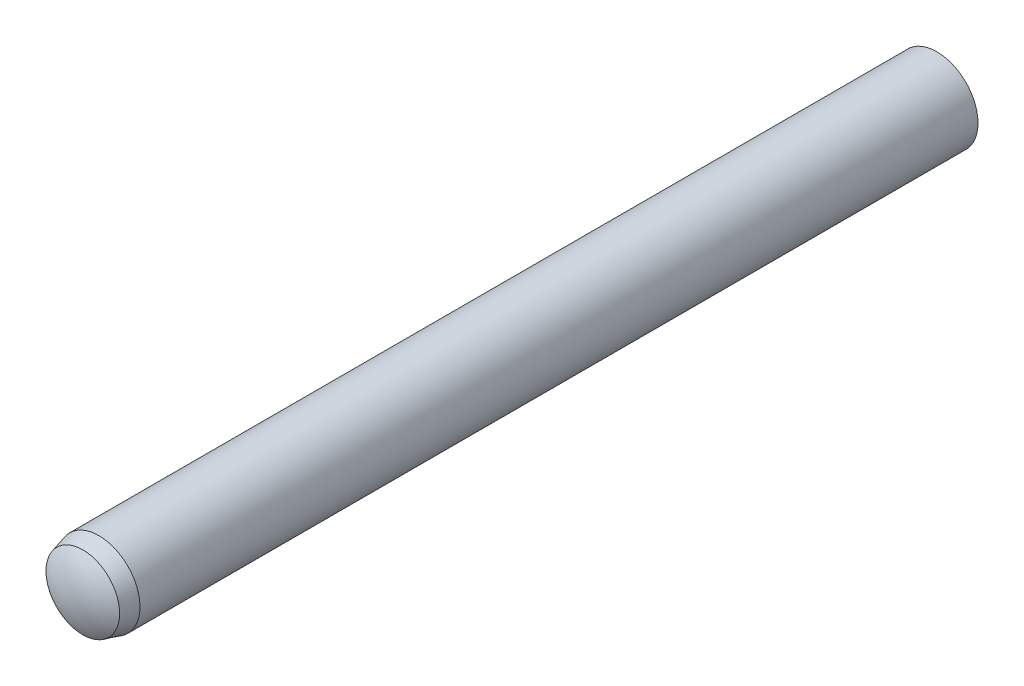
ISO-10303-21;
HEADER;
FILE_DESCRIPTION(('STEP AP214'),'2;1');
FILE_NAME('part.step','',(''),(''),'','','');
FILE_SCHEMA(('AUTOMOTIVE_DESIGN { 1 0 10303 214 1 1 1 1 }'));
ENDSEC;
DATA;
#1=APPLICATION_CONTEXT('core data for automotive mechanical design processes');
#2=APPLICATION_PROTOCOL_DEFINITION('international standard','automotive_design',2000,#1);
#3=PRODUCT_CONTEXT('',#1,'mechanical');
#4=PRODUCT('Part','Part','',(#3));
#5=PRODUCT_RELATED_PRODUCT_CATEGORY('part','',(#4));
#6=PRODUCT_DEFINITION_FORMATION('','',#4);
#7=PRODUCT_DEFINITION_CONTEXT('part definition',#1,'design');
#8=PRODUCT_DEFINITION('design','',#6,#7);
#9=PRODUCT_DEFINITION_SHAPE('','',#8);
#10=(LENGTH_UNIT() NAMED_UNIT(*) SI_UNIT(.MILLI.,.METRE.));
#11=(NAMED_UNIT(*) PLANE_ANGLE_UNIT() SI_UNIT($,.RADIAN.));
#12=(NAMED_UNIT(*) SI_UNIT($,.STERADIAN.) SOLID_ANGLE_UNIT());
#13=UNCERTAINTY_MEASURE_WITH_UNIT(LENGTH_MEASURE(1.E-05),#10,'distance_accuracy_value','');
#14=(GEOMETRIC_REPRESENTATION_CONTEXT(3) GLOBAL_UNCERTAINTY_ASSIGNED_CONTEXT((#13)) GLOBAL_UNIT_ASSIGNED_CONTEXT((#10,
#11,#12)) REPRESENTATION_CONTEXT('',''));
#15=CARTESIAN_POINT('',(0.,0.,0.));
#16=DIRECTION('',(0.,0.,1.));
#17=DIRECTION('',(1.,0.,0.));
#18=AXIS2_PLACEMENT_3D('',#15,#16,#17);
#19=CARTESIAN_POINT('',(0.,0.,-13.275));
#20=DIRECTION('',(0.,0.,1.));
#21=DIRECTION('',(0.,1.,0.));
#22=AXIS2_PLACEMENT_3D('',#19,#20,#21);
#23=SPHERICAL_SURFACE('',#22,2.72499999999998);
#24=CARTESIAN_POINT('',(0.,0.,-15.55));
#25=DIRECTION('',(0.,0.,1.));
#26=DIRECTION('',(0.,-1.,0.));
#27=AXIS2_PLACEMENT_3D('',#24,#25,#26);
#28=CIRCLE('',#27,1.49999999999999);
#29=CARTESIAN_POINT('',(0.,-1.49999999999999,-15.55));
#30=VERTEX_POINT('',#29);
#31=EDGE_CURVE('E10',#30,#30,#28,.T.);
#32=ORIENTED_EDGE('',*,*,#31,.F.);
#33=EDGE_LOOP('',(#32));
#34=FACE_BOUND('',#33,.T.);
#35=ADVANCED_FACE('F30',(#34),#23,.T.);
#36=CARTESIAN_POINT('',(0.,0.,16.));
#37=DIRECTION('',(0.,0.,1.));
#38=DIRECTION('',(0.,-1.,0.));
#39=AXIS2_PLACEMENT_3D('',#36,#37,#38);
#40=CYLINDRICAL_SURFACE('',#39,1.5);
#41=CARTESIAN_POINT('',(0.,0.,15.025));
#42=DIRECTION('',(0.,0.,1.));
#43=DIRECTION('',(0.,-1.,0.));
#44=AXIS2_PLACEMENT_3D('',#41,#42,#43);
#45=CIRCLE('',#44,1.5);
#46=CARTESIAN_POINT('',(0.,-1.5,15.025));
#47=VERTEX_POINT('',#46);
#48=EDGE_CURVE('E36',#47,#47,#45,.T.);
#49=ORIENTED_EDGE('',*,*,#48,.F.);
#50=EDGE_LOOP('',(#49));
#51=FACE_BOUND('',#50,.T.);
#52=ORIENTED_EDGE('',*,*,#31,.T.);
#53=EDGE_LOOP('',(#52));
#54=FACE_BOUND('',#53,.T.);
#55=ADVANCED_FACE('F51',(#51,#54),#40,.T.);
#56=CARTESIAN_POINT('',(0.,0.,15.025));
#57=DIRECTION('',(0.,0.,-1.));
#58=DIRECTION('',(0.,1.,0.));
#59=AXIS2_PLACEMENT_3D('',#56,#57,#58);
#60=CONICAL_SURFACE('',#59,1.5,0.26179938779915);
#61=CARTESIAN_POINT('',(0.,0.,15.61));
#62=DIRECTION('',(0.,0.,1.));
#63=DIRECTION('',(0.,-1.,0.));
#64=AXIS2_PLACEMENT_3D('',#61,#62,#63);
#65=CIRCLE('',#64,1.34324972242779);
#66=CARTESIAN_POINT('',(0.,-1.34324972242779,15.61));
#67=VERTEX_POINT('',#66);
#68=EDGE_CURVE('E40',#67,#67,#65,.T.);
#69=ORIENTED_EDGE('',*,*,#68,.F.);
#70=EDGE_LOOP('',(#69));
#71=FACE_BOUND('',#70,.T.);
#72=ORIENTED_EDGE('',*,*,#48,.T.);
#73=EDGE_LOOP('',(#72));
#74=FACE_BOUND('',#73,.T.);
#75=ADVANCED_FACE('F49',(#71,#74),#60,.T.);
#76=CARTESIAN_POINT('',(0.,0.,13.491769465638));
#77=DIRECTION('',(0.,0.,1.));
#78=DIRECTION('',(0.,1.,0.));
#79=AXIS2_PLACEMENT_3D('',#76,#77,#78);
#80=SPHERICAL_SURFACE('',#79,2.50823053436198);
#81=ORIENTED_EDGE('',*,*,#68,.T.);
#82=EDGE_LOOP('',(#81));
#83=FACE_BOUND('',#82,.T.);
#84=ADVANCED_FACE('F47',(#83),#80,.T.);
#85=CLOSED_SHELL('',(#35,#55,#75,#84));
#86=MANIFOLD_SOLID_BREP('B2',#85);
#87=ADVANCED_BREP_SHAPE_REPRESENTATION('',(#18,#86),#14);
#88=SHAPE_DEFINITION_REPRESENTATION(#9,#87);
ENDSEC;
END-ISO-10303-21;
